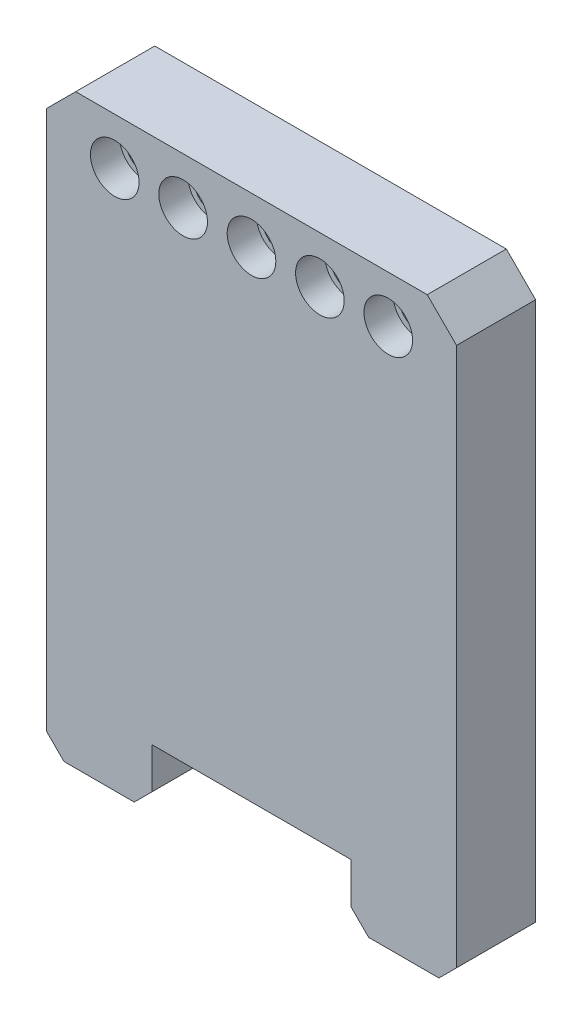
ISO-10303-21;
HEADER;
FILE_DESCRIPTION(('STEP AP214'),'2;1');
FILE_NAME('part.step','',(''),(''),'','','');
FILE_SCHEMA(('AUTOMOTIVE_DESIGN { 1 0 10303 214 1 1 1 1 }'));
ENDSEC;
DATA;
#1=APPLICATION_CONTEXT('core data for automotive mechanical design processes');
#2=APPLICATION_PROTOCOL_DEFINITION('international standard','automotive_design',2000,#1);
#3=PRODUCT_CONTEXT('',#1,'mechanical');
#4=PRODUCT('Part','Part','',(#3));
#5=PRODUCT_RELATED_PRODUCT_CATEGORY('part','',(#4));
#6=PRODUCT_DEFINITION_FORMATION('','',#4);
#7=PRODUCT_DEFINITION_CONTEXT('part definition',#1,'design');
#8=PRODUCT_DEFINITION('design','',#6,#7);
#9=PRODUCT_DEFINITION_SHAPE('','',#8);
#10=(LENGTH_UNIT() NAMED_UNIT(*) SI_UNIT(.MILLI.,.METRE.));
#11=(NAMED_UNIT(*) PLANE_ANGLE_UNIT() SI_UNIT($,.RADIAN.));
#12=(NAMED_UNIT(*) SI_UNIT($,.STERADIAN.) SOLID_ANGLE_UNIT());
#13=UNCERTAINTY_MEASURE_WITH_UNIT(LENGTH_MEASURE(1.E-05),#10,'distance_accuracy_value','');
#14=(GEOMETRIC_REPRESENTATION_CONTEXT(3) GLOBAL_UNCERTAINTY_ASSIGNED_CONTEXT((#13)) GLOBAL_UNIT_ASSIGNED_CONTEXT((#10,
#11,#12)) REPRESENTATION_CONTEXT('',''));
#15=CARTESIAN_POINT('',(0.,0.,0.));
#16=DIRECTION('',(0.,0.,1.));
#17=DIRECTION('',(1.,0.,0.));
#18=AXIS2_PLACEMENT_3D('',#15,#16,#17);
#19=CARTESIAN_POINT('',(0.,-50.,0.));
#20=DIRECTION('',(0.,1.,0.));
#21=DIRECTION('',(0.,0.,1.));
#22=AXIS2_PLACEMENT_3D('',#19,#20,#21);
#23=PLANE('',#22);
#24=DIRECTION('',(-1.,0.,0.));
#25=VECTOR('',#24,1.);
#26=CARTESIAN_POINT('',(-35.,-50.,-6.75));
#27=LINE('',#26,#25);
#28=CARTESIAN_POINT('',(-20.,-50.,-6.75));
#29=VERTEX_POINT('',#28);
#30=CARTESIAN_POINT('',(-32.,-50.,-6.75));
#31=VERTEX_POINT('',#30);
#32=EDGE_CURVE('E187',#29,#31,#27,.T.);
#33=ORIENTED_EDGE('',*,*,#32,.F.);
#34=DIRECTION('',(0.,0.,1.));
#35=VECTOR('',#34,1.);
#36=CARTESIAN_POINT('',(-20.,-50.,0.));
#37=LINE('',#36,#35);
#38=CARTESIAN_POINT('',(-20.,-50.,6.75));
#39=VERTEX_POINT('',#38);
#40=EDGE_CURVE('E279',#29,#39,#37,.T.);
#41=ORIENTED_EDGE('',*,*,#40,.T.);
#42=DIRECTION('',(1.,0.,0.));
#43=VECTOR('',#42,1.);
#44=CARTESIAN_POINT('',(-35.,-50.,6.75));
#45=LINE('',#44,#43);
#46=CARTESIAN_POINT('',(-32.,-50.,6.75));
#47=VERTEX_POINT('',#46);
#48=EDGE_CURVE('E193',#47,#39,#45,.T.);
#49=ORIENTED_EDGE('',*,*,#48,.F.);
#50=DIRECTION('',(0.,0.,-1.));
#51=VECTOR('',#50,1.);
#52=CARTESIAN_POINT('',(-32.,-50.,0.));
#53=LINE('',#52,#51);
#54=EDGE_CURVE('E276',#47,#31,#53,.T.);
#55=ORIENTED_EDGE('',*,*,#54,.T.);
#56=EDGE_LOOP('',(#33,#41,#49,#55));
#57=FACE_BOUND('',#56,.T.);
#58=ADVANCED_FACE('F43',(#57),#23,.F.);
#59=CARTESIAN_POINT('',(35.,50.,-6.75));
#60=DIRECTION('',(-1.,0.,0.));
#61=DIRECTION('',(0.,0.,1.));
#62=AXIS2_PLACEMENT_3D('',#59,#60,#61);
#63=PLANE('',#62);
#64=DIRECTION('',(0.,-1.,0.));
#65=VECTOR('',#64,1.);
#66=CARTESIAN_POINT('',(35.,50.,-6.75));
#67=LINE('',#66,#65);
#68=CARTESIAN_POINT('',(35.,45.,-6.75));
#69=VERTEX_POINT('',#68);
#70=CARTESIAN_POINT('',(35.,-47.,-6.75));
#71=VERTEX_POINT('',#70);
#72=EDGE_CURVE('E214',#69,#71,#67,.T.);
#73=ORIENTED_EDGE('',*,*,#72,.F.);
#74=DIRECTION('',(0.,0.,1.));
#75=VECTOR('',#74,1.);
#76=CARTESIAN_POINT('',(35.,45.,6.75));
#77=LINE('',#76,#75);
#78=CARTESIAN_POINT('',(35.,45.,6.75));
#79=VERTEX_POINT('',#78);
#80=EDGE_CURVE('E68',#69,#79,#77,.T.);
#81=ORIENTED_EDGE('',*,*,#80,.T.);
#82=DIRECTION('',(0.,-1.,0.));
#83=VECTOR('',#82,1.);
#84=CARTESIAN_POINT('',(35.,50.,6.75));
#85=LINE('',#84,#83);
#86=CARTESIAN_POINT('',(35.,-47.,6.75));
#87=VERTEX_POINT('',#86);
#88=EDGE_CURVE('E197',#79,#87,#85,.T.);
#89=ORIENTED_EDGE('',*,*,#88,.T.);
#90=DIRECTION('',(0.,0.,-1.));
#91=VECTOR('',#90,1.);
#92=CARTESIAN_POINT('',(35.,-47.,-6.75));
#93=LINE('',#92,#91);
#94=EDGE_CURVE('E286',#87,#71,#93,.T.);
#95=ORIENTED_EDGE('',*,*,#94,.T.);
#96=EDGE_LOOP('',(#73,#81,#89,#95));
#97=FACE_BOUND('',#96,.T.);
#98=ADVANCED_FACE('F323',(#97),#63,.F.);
#99=CARTESIAN_POINT('',(-35.,50.,-6.75));
#100=DIRECTION('',(0.,0.,1.));
#101=DIRECTION('',(1.,0.,0.));
#102=AXIS2_PLACEMENT_3D('',#99,#100,#101);
#103=PLANE('',#102);
#104=DIRECTION('',(-1.,0.,0.));
#105=VECTOR('',#104,1.);
#106=CARTESIAN_POINT('',(-35.,50.,-6.75));
#107=LINE('',#106,#105);
#108=CARTESIAN_POINT('',(30.,50.,-6.75));
#109=VERTEX_POINT('',#108);
#110=CARTESIAN_POINT('',(-30.,50.,-6.75));
#111=VERTEX_POINT('',#110);
#112=EDGE_CURVE('E188',#109,#111,#107,.T.);
#113=ORIENTED_EDGE('',*,*,#112,.F.);
#114=DIRECTION('',(0.707106781186546,-0.707106781186549,0.));
#115=VECTOR('',#114,1.);
#116=CARTESIAN_POINT('',(30.,50.,-6.75));
#117=LINE('',#116,#115);
#118=EDGE_CURVE('E305',#109,#69,#117,.T.);
#119=ORIENTED_EDGE('',*,*,#118,.T.);
#120=ORIENTED_EDGE('',*,*,#72,.T.);
#121=DIRECTION('',(0.70710678118655,0.707106781186545,0.));
#122=VECTOR('',#121,1.);
#123=CARTESIAN_POINT('',(35.,-47.,-6.75));
#124=LINE('',#123,#122);
#125=CARTESIAN_POINT('',(32.,-50.,-6.75));
#126=VERTEX_POINT('',#125);
#127=EDGE_CURVE('E252',#71,#126,#124,.F.);
#128=ORIENTED_EDGE('',*,*,#127,.T.);
#129=CARTESIAN_POINT('',(20.,-50.,-6.75));
#130=VERTEX_POINT('',#129);
#131=EDGE_CURVE('E201',#126,#130,#27,.T.);
#132=ORIENTED_EDGE('',*,*,#131,.T.);
#133=DIRECTION('',(0.707106781186548,-0.707106781186548,0.));
#134=VECTOR('',#133,1.);
#135=CARTESIAN_POINT('',(20.,-50.,-6.75));
#136=LINE('',#135,#134);
#137=CARTESIAN_POINT('',(17.,-47.,-6.75));
#138=VERTEX_POINT('',#137);
#139=EDGE_CURVE('E258',#130,#138,#136,.F.);
#140=ORIENTED_EDGE('',*,*,#139,.T.);
#141=DIRECTION('',(0.,1.,0.));
#142=VECTOR('',#141,1.);
#143=CARTESIAN_POINT('',(17.,50.,-6.75));
#144=LINE('',#143,#142);
#145=CARTESIAN_POINT('',(17.,-40.,-6.75000000000001));
#146=VERTEX_POINT('',#145);
#147=EDGE_CURVE('E177',#138,#146,#144,.T.);
#148=ORIENTED_EDGE('',*,*,#147,.T.);
#149=DIRECTION('',(-1.,0.,0.));
#150=VECTOR('',#149,1.);
#151=CARTESIAN_POINT('',(-35.,-40.,-6.75));
#152=LINE('',#151,#150);
#153=CARTESIAN_POINT('',(-17.,-40.,-6.75000000000001));
#154=VERTEX_POINT('',#153);
#155=EDGE_CURVE('E166',#146,#154,#152,.T.);
#156=ORIENTED_EDGE('',*,*,#155,.T.);
#157=DIRECTION('',(0.,-1.,0.));
#158=VECTOR('',#157,1.);
#159=CARTESIAN_POINT('',(-16.9999999999999,50.,-6.75));
#160=LINE('',#159,#158);
#161=CARTESIAN_POINT('',(-17.,-47.,-6.75));
#162=VERTEX_POINT('',#161);
#163=EDGE_CURVE('E181',#154,#162,#160,.T.);
#164=ORIENTED_EDGE('',*,*,#163,.T.);
#165=DIRECTION('',(0.707106781186548,0.707106781186548,0.));
#166=VECTOR('',#165,1.);
#167=CARTESIAN_POINT('',(-20.,-50.,-6.75));
#168=LINE('',#167,#166);
#169=EDGE_CURVE('E255',#162,#29,#168,.F.);
#170=ORIENTED_EDGE('',*,*,#169,.T.);
#171=ORIENTED_EDGE('',*,*,#32,.T.);
#172=DIRECTION('',(0.707106781186549,-0.707106781186546,0.));
#173=VECTOR('',#172,1.);
#174=CARTESIAN_POINT('',(-35.,-47.,-6.75));
#175=LINE('',#174,#173);
#176=CARTESIAN_POINT('',(-35.,-47.,-6.75));
#177=VERTEX_POINT('',#176);
#178=EDGE_CURVE('E248',#31,#177,#175,.F.);
#179=ORIENTED_EDGE('',*,*,#178,.T.);
#180=DIRECTION('',(0.,-1.,0.));
#181=VECTOR('',#180,1.);
#182=CARTESIAN_POINT('',(-35.,50.,-6.75));
#183=LINE('',#182,#181);
#184=CARTESIAN_POINT('',(-35.,45.,-6.75));
#185=VERTEX_POINT('',#184);
#186=EDGE_CURVE('E211',#185,#177,#183,.T.);
#187=ORIENTED_EDGE('',*,*,#186,.F.);
#188=DIRECTION('',(0.707106781186546,0.707106781186549,0.));
#189=VECTOR('',#188,1.);
#190=CARTESIAN_POINT('',(-30.,50.,-6.75));
#191=LINE('',#190,#189);
#192=EDGE_CURVE('E302',#185,#111,#191,.T.);
#193=ORIENTED_EDGE('',*,*,#192,.T.);
#194=EDGE_LOOP('',(#113,#119,#120,#128,#132,#140,#148,#156,#164,#170,#171,#179,#187,#193));
#195=FACE_BOUND('',#194,.T.);
#196=ADVANCED_FACE('F321',(#195),#103,.F.);
#197=CARTESIAN_POINT('',(-35.,50.,-6.75));
#198=DIRECTION('',(1.,0.,0.));
#199=DIRECTION('',(0.,0.,-1.));
#200=AXIS2_PLACEMENT_3D('',#197,#198,#199);
#201=PLANE('',#200);
#202=DIRECTION('',(0.,-1.,0.));
#203=VECTOR('',#202,1.);
#204=CARTESIAN_POINT('',(-35.,50.,6.75));
#205=LINE('',#204,#203);
#206=CARTESIAN_POINT('',(-35.,45.,6.75));
#207=VERTEX_POINT('',#206);
#208=CARTESIAN_POINT('',(-35.,-47.,6.75));
#209=VERTEX_POINT('',#208);
#210=EDGE_CURVE('E208',#207,#209,#205,.T.);
#211=ORIENTED_EDGE('',*,*,#210,.F.);
#212=DIRECTION('',(0.,0.,-1.));
#213=VECTOR('',#212,1.);
#214=CARTESIAN_POINT('',(-35.,45.,-6.75));
#215=LINE('',#214,#213);
#216=EDGE_CURVE('E11',#207,#185,#215,.T.);
#217=ORIENTED_EDGE('',*,*,#216,.T.);
#218=ORIENTED_EDGE('',*,*,#186,.T.);
#219=DIRECTION('',(0.,0.,1.));
#220=VECTOR('',#219,1.);
#221=CARTESIAN_POINT('',(-35.,-47.,-6.75));
#222=LINE('',#221,#220);
#223=EDGE_CURVE('E290',#177,#209,#222,.T.);
#224=ORIENTED_EDGE('',*,*,#223,.T.);
#225=EDGE_LOOP('',(#211,#217,#218,#224));
#226=FACE_BOUND('',#225,.T.);
#227=ADVANCED_FACE('F356',(#226),#201,.F.);
#228=CARTESIAN_POINT('',(-35.,50.,6.75));
#229=DIRECTION('',(0.,0.,-1.));
#230=DIRECTION('',(-1.,0.,0.));
#231=AXIS2_PLACEMENT_3D('',#228,#229,#230);
#232=PLANE('',#231);
#233=CARTESIAN_POINT('',(-23.33,42.,6.75));
#234=DIRECTION('',(0.,0.,1.));
#235=DIRECTION('',(1.,0.,0.));
#236=AXIS2_PLACEMENT_3D('',#233,#234,#235);
#237=CIRCLE('',#236,4.15);
#238=CARTESIAN_POINT('',(-19.18,42.,6.75));
#239=VERTEX_POINT('',#238);
#240=EDGE_CURVE('E549',#239,#239,#237,.T.);
#241=ORIENTED_EDGE('',*,*,#240,.F.);
#242=EDGE_LOOP('',(#241));
#243=FACE_BOUND('',#242,.T.);
#244=CARTESIAN_POINT('',(-11.66,42.,6.75));
#245=DIRECTION('',(0.,0.,1.));
#246=DIRECTION('',(1.,0.,0.));
#247=AXIS2_PLACEMENT_3D('',#244,#245,#246);
#248=CIRCLE('',#247,4.15);
#249=CARTESIAN_POINT('',(-7.51000000000002,42.,6.75));
#250=VERTEX_POINT('',#249);
#251=EDGE_CURVE('E557',#250,#250,#248,.T.);
#252=ORIENTED_EDGE('',*,*,#251,.F.);
#253=EDGE_LOOP('',(#252));
#254=FACE_BOUND('',#253,.T.);
#255=CARTESIAN_POINT('',(0.00999999999997531,42.,6.75));
#256=DIRECTION('',(0.,0.,1.));
#257=DIRECTION('',(1.,0.,0.));
#258=AXIS2_PLACEMENT_3D('',#255,#256,#257);
#259=CIRCLE('',#258,4.15);
#260=CARTESIAN_POINT('',(4.15999999999998,42.,6.75));
#261=VERTEX_POINT('',#260);
#262=EDGE_CURVE('E565',#261,#261,#259,.T.);
#263=ORIENTED_EDGE('',*,*,#262,.F.);
#264=EDGE_LOOP('',(#263));
#265=FACE_BOUND('',#264,.T.);
#266=CARTESIAN_POINT('',(11.68,42.,6.75));
#267=DIRECTION('',(0.,0.,1.));
#268=DIRECTION('',(1.,0.,0.));
#269=AXIS2_PLACEMENT_3D('',#266,#267,#268);
#270=CIRCLE('',#269,4.15);
#271=CARTESIAN_POINT('',(15.83,42.,6.75));
#272=VERTEX_POINT('',#271);
#273=EDGE_CURVE('E573',#272,#272,#270,.T.);
#274=ORIENTED_EDGE('',*,*,#273,.F.);
#275=EDGE_LOOP('',(#274));
#276=FACE_BOUND('',#275,.T.);
#277=CARTESIAN_POINT('',(23.35,42.,6.75));
#278=DIRECTION('',(0.,0.,1.));
#279=DIRECTION('',(1.,0.,0.));
#280=AXIS2_PLACEMENT_3D('',#277,#278,#279);
#281=CIRCLE('',#280,4.15);
#282=CARTESIAN_POINT('',(27.5,42.,6.75));
#283=VERTEX_POINT('',#282);
#284=EDGE_CURVE('E501',#283,#283,#281,.T.);
#285=ORIENTED_EDGE('',*,*,#284,.F.);
#286=EDGE_LOOP('',(#285));
#287=FACE_BOUND('',#286,.T.);
#288=ORIENTED_EDGE('',*,*,#88,.F.);
#289=DIRECTION('',(-0.707106781186546,0.707106781186549,0.));
#290=VECTOR('',#289,1.);
#291=CARTESIAN_POINT('',(30.,50.,6.75));
#292=LINE('',#291,#290);
#293=CARTESIAN_POINT('',(30.,50.,6.75));
#294=VERTEX_POINT('',#293);
#295=EDGE_CURVE('E53',#79,#294,#292,.T.);
#296=ORIENTED_EDGE('',*,*,#295,.T.);
#297=DIRECTION('',(1.,0.,0.));
#298=VECTOR('',#297,1.);
#299=CARTESIAN_POINT('',(-35.,50.,6.75));
#300=LINE('',#299,#298);
#301=CARTESIAN_POINT('',(-30.,50.,6.75));
#302=VERTEX_POINT('',#301);
#303=EDGE_CURVE('E192',#302,#294,#300,.T.);
#304=ORIENTED_EDGE('',*,*,#303,.F.);
#305=DIRECTION('',(-0.707106781186546,-0.707106781186549,0.));
#306=VECTOR('',#305,1.);
#307=CARTESIAN_POINT('',(-30.,50.,6.75));
#308=LINE('',#307,#306);
#309=EDGE_CURVE('E60',#302,#207,#308,.T.);
#310=ORIENTED_EDGE('',*,*,#309,.T.);
#311=ORIENTED_EDGE('',*,*,#210,.T.);
#312=DIRECTION('',(-0.707106781186549,0.707106781186546,0.));
#313=VECTOR('',#312,1.);
#314=CARTESIAN_POINT('',(-35.,-47.,6.75));
#315=LINE('',#314,#313);
#316=EDGE_CURVE('E263',#209,#47,#315,.F.);
#317=ORIENTED_EDGE('',*,*,#316,.T.);
#318=ORIENTED_EDGE('',*,*,#48,.T.);
#319=DIRECTION('',(-0.707106781186548,-0.707106781186548,0.));
#320=VECTOR('',#319,1.);
#321=CARTESIAN_POINT('',(-20.,-50.,6.75));
#322=LINE('',#321,#320);
#323=CARTESIAN_POINT('',(-17.,-47.,6.75));
#324=VERTEX_POINT('',#323);
#325=EDGE_CURVE('E270',#39,#324,#322,.F.);
#326=ORIENTED_EDGE('',*,*,#325,.T.);
#327=DIRECTION('',(0.,-1.,0.));
#328=VECTOR('',#327,1.);
#329=CARTESIAN_POINT('',(-17.,-50.,6.75));
#330=LINE('',#329,#328);
#331=CARTESIAN_POINT('',(-17.,-40.,6.75));
#332=VERTEX_POINT('',#331);
#333=EDGE_CURVE('E157',#332,#324,#330,.T.);
#334=ORIENTED_EDGE('',*,*,#333,.F.);
#335=DIRECTION('',(-1.,0.,0.));
#336=VECTOR('',#335,1.);
#337=CARTESIAN_POINT('',(-17.,-40.,6.75));
#338=LINE('',#337,#336);
#339=CARTESIAN_POINT('',(17.,-40.,6.75));
#340=VERTEX_POINT('',#339);
#341=EDGE_CURVE('E156',#340,#332,#338,.T.);
#342=ORIENTED_EDGE('',*,*,#341,.F.);
#343=DIRECTION('',(0.,1.,0.));
#344=VECTOR('',#343,1.);
#345=CARTESIAN_POINT('',(17.,-50.,6.75));
#346=LINE('',#345,#344);
#347=CARTESIAN_POINT('',(17.,-47.,6.75));
#348=VERTEX_POINT('',#347);
#349=EDGE_CURVE('E146',#348,#340,#346,.T.);
#350=ORIENTED_EDGE('',*,*,#349,.F.);
#351=DIRECTION('',(-0.707106781186548,0.707106781186548,0.));
#352=VECTOR('',#351,1.);
#353=CARTESIAN_POINT('',(20.,-50.,6.75));
#354=LINE('',#353,#352);
#355=CARTESIAN_POINT('',(20.,-50.,6.75));
#356=VERTEX_POINT('',#355);
#357=EDGE_CURVE('E273',#348,#356,#354,.F.);
#358=ORIENTED_EDGE('',*,*,#357,.T.);
#359=CARTESIAN_POINT('',(32.,-50.,6.75));
#360=VERTEX_POINT('',#359);
#361=EDGE_CURVE('E205',#356,#360,#45,.T.);
#362=ORIENTED_EDGE('',*,*,#361,.T.);
#363=DIRECTION('',(-0.70710678118655,-0.707106781186545,0.));
#364=VECTOR('',#363,1.);
#365=CARTESIAN_POINT('',(35.,-47.,6.75));
#366=LINE('',#365,#364);
#367=EDGE_CURVE('E266',#360,#87,#366,.F.);
#368=ORIENTED_EDGE('',*,*,#367,.T.);
#369=EDGE_LOOP('',(#288,#296,#304,#310,#311,#317,#318,#326,#334,#342,#350,#358,#362,#368));
#370=FACE_BOUND('',#369,.T.);
#371=ADVANCED_FACE('F170',(#243,#254,#265,#276,#287,#370),#232,.F.);
#372=CARTESIAN_POINT('',(0.,50.,0.));
#373=DIRECTION('',(0.,1.,0.));
#374=DIRECTION('',(0.,0.,1.));
#375=AXIS2_PLACEMENT_3D('',#372,#373,#374);
#376=PLANE('',#375);
#377=ORIENTED_EDGE('',*,*,#303,.T.);
#378=DIRECTION('',(0.,0.,-1.));
#379=VECTOR('',#378,1.);
#380=CARTESIAN_POINT('',(30.,50.,-6.75));
#381=LINE('',#380,#379);
#382=EDGE_CURVE('E298',#294,#109,#381,.T.);
#383=ORIENTED_EDGE('',*,*,#382,.T.);
#384=ORIENTED_EDGE('',*,*,#112,.T.);
#385=DIRECTION('',(0.,0.,1.));
#386=VECTOR('',#385,1.);
#387=CARTESIAN_POINT('',(-30.,50.,6.75));
#388=LINE('',#387,#386);
#389=EDGE_CURVE('E294',#111,#302,#388,.T.);
#390=ORIENTED_EDGE('',*,*,#389,.T.);
#391=EDGE_LOOP('',(#377,#383,#384,#390));
#392=FACE_BOUND('',#391,.T.);
#393=ADVANCED_FACE('F316',(#392),#376,.T.);
#394=ORIENTED_EDGE('',*,*,#361,.F.);
#395=DIRECTION('',(0.,0.,-1.));
#396=VECTOR('',#395,1.);
#397=CARTESIAN_POINT('',(20.,-50.,0.));
#398=LINE('',#397,#396);
#399=EDGE_CURVE('E244',#356,#130,#398,.T.);
#400=ORIENTED_EDGE('',*,*,#399,.T.);
#401=ORIENTED_EDGE('',*,*,#131,.F.);
#402=DIRECTION('',(0.,0.,1.));
#403=VECTOR('',#402,1.);
#404=CARTESIAN_POINT('',(32.,-50.,0.));
#405=LINE('',#404,#403);
#406=EDGE_CURVE('E241',#126,#360,#405,.T.);
#407=ORIENTED_EDGE('',*,*,#406,.T.);
#408=EDGE_LOOP('',(#394,#400,#401,#407));
#409=FACE_BOUND('',#408,.T.);
#410=ADVANCED_FACE('F333',(#409),#23,.F.);
#411=CARTESIAN_POINT('',(-17.,-40.,-93.25));
#412=DIRECTION('',(0.,1.,0.));
#413=DIRECTION('',(0.,0.,1.));
#414=AXIS2_PLACEMENT_3D('',#411,#412,#413);
#415=PLANE('',#414);
#416=CARTESIAN_POINT('',(10.,-40.,0.));
#417=DIRECTION('',(0.,1.,0.));
#418=DIRECTION('',(0.,0.,1.));
#419=AXIS2_PLACEMENT_3D('',#416,#417,#418);
#420=CIRCLE('',#419,3.72499999999999);
#421=CARTESIAN_POINT('',(10.,-40.,3.725));
#422=VERTEX_POINT('',#421);
#423=EDGE_CURVE('E229',#422,#422,#420,.T.);
#424=ORIENTED_EDGE('',*,*,#423,.T.);
#425=EDGE_LOOP('',(#424));
#426=FACE_BOUND('',#425,.T.);
#427=CARTESIAN_POINT('',(0.,-40.,0.));
#428=DIRECTION('',(0.,1.,0.));
#429=DIRECTION('',(0.,0.,1.));
#430=AXIS2_PLACEMENT_3D('',#427,#428,#429);
#431=CIRCLE('',#430,3.72499999999999);
#432=CARTESIAN_POINT('',(0.,-40.,3.72499999999999));
#433=VERTEX_POINT('',#432);
#434=EDGE_CURVE('E225',#433,#433,#431,.T.);
#435=ORIENTED_EDGE('',*,*,#434,.T.);
#436=EDGE_LOOP('',(#435));
#437=FACE_BOUND('',#436,.T.);
#438=CARTESIAN_POINT('',(-10.,-40.,0.));
#439=DIRECTION('',(0.,1.,0.));
#440=DIRECTION('',(0.,0.,1.));
#441=AXIS2_PLACEMENT_3D('',#438,#439,#440);
#442=CIRCLE('',#441,3.72499999999999);
#443=CARTESIAN_POINT('',(-10.,-40.,3.72499999999999));
#444=VERTEX_POINT('',#443);
#445=EDGE_CURVE('E221',#444,#444,#442,.T.);
#446=ORIENTED_EDGE('',*,*,#445,.T.);
#447=EDGE_LOOP('',(#446));
#448=FACE_BOUND('',#447,.T.);
#449=DIRECTION('',(0.,0.,1.));
#450=VECTOR('',#449,1.);
#451=CARTESIAN_POINT('',(17.,-40.,-93.25));
#452=LINE('',#451,#450);
#453=EDGE_CURVE('E150',#146,#340,#452,.T.);
#454=ORIENTED_EDGE('',*,*,#453,.T.);
#455=ORIENTED_EDGE('',*,*,#341,.T.);
#456=DIRECTION('',(0.,0.,1.));
#457=VECTOR('',#456,1.);
#458=CARTESIAN_POINT('',(-17.,-40.,-93.25));
#459=LINE('',#458,#457);
#460=EDGE_CURVE('E168',#154,#332,#459,.T.);
#461=ORIENTED_EDGE('',*,*,#460,.F.);
#462=ORIENTED_EDGE('',*,*,#155,.F.);
#463=EDGE_LOOP('',(#454,#455,#461,#462));
#464=FACE_BOUND('',#463,.T.);
#465=ADVANCED_FACE('F162',(#426,#437,#448,#464),#415,.F.);
#466=CARTESIAN_POINT('',(-17.,-50.,-93.25));
#467=DIRECTION('',(-1.,0.,0.));
#468=DIRECTION('',(0.,-1.,0.));
#469=AXIS2_PLACEMENT_3D('',#466,#467,#468);
#470=PLANE('',#469);
#471=ORIENTED_EDGE('',*,*,#333,.T.);
#472=DIRECTION('',(0.,0.,-1.));
#473=VECTOR('',#472,1.);
#474=CARTESIAN_POINT('',(-17.,-47.,-93.25));
#475=LINE('',#474,#473);
#476=EDGE_CURVE('E283',#324,#162,#475,.T.);
#477=ORIENTED_EDGE('',*,*,#476,.T.);
#478=ORIENTED_EDGE('',*,*,#163,.F.);
#479=ORIENTED_EDGE('',*,*,#460,.T.);
#480=EDGE_LOOP('',(#471,#477,#478,#479));
#481=FACE_BOUND('',#480,.T.);
#482=ADVANCED_FACE('F378',(#481),#470,.F.);
#483=CARTESIAN_POINT('',(17.,-50.,-93.25));
#484=DIRECTION('',(1.,0.,0.));
#485=DIRECTION('',(0.,0.,-1.));
#486=AXIS2_PLACEMENT_3D('',#483,#484,#485);
#487=PLANE('',#486);
#488=ORIENTED_EDGE('',*,*,#147,.F.);
#489=DIRECTION('',(0.,0.,1.));
#490=VECTOR('',#489,1.);
#491=CARTESIAN_POINT('',(17.,-47.,-93.25));
#492=LINE('',#491,#490);
#493=EDGE_CURVE('E152',#138,#348,#492,.T.);
#494=ORIENTED_EDGE('',*,*,#493,.T.);
#495=ORIENTED_EDGE('',*,*,#349,.T.);
#496=ORIENTED_EDGE('',*,*,#453,.F.);
#497=EDGE_LOOP('',(#488,#494,#495,#496));
#498=FACE_BOUND('',#497,.T.);
#499=ADVANCED_FACE('F149',(#498),#487,.F.);
#500=CARTESIAN_POINT('',(10.,-37.,0.));
#501=DIRECTION('',(0.,-1.,0.));
#502=DIRECTION('',(0.,0.,-1.));
#503=AXIS2_PLACEMENT_3D('',#500,#501,#502);
#504=CYLINDRICAL_SURFACE('',#503,3.225);
#505=CARTESIAN_POINT('',(10.,-39.5,0.));
#506=DIRECTION('',(0.,1.,0.));
#507=DIRECTION('',(0.,0.,1.));
#508=AXIS2_PLACEMENT_3D('',#505,#506,#507);
#509=CIRCLE('',#508,3.225);
#510=CARTESIAN_POINT('',(10.,-39.5,3.225));
#511=VERTEX_POINT('',#510);
#512=EDGE_CURVE('E217',#511,#511,#509,.F.);
#513=ORIENTED_EDGE('',*,*,#512,.T.);
#514=EDGE_LOOP('',(#513));
#515=FACE_BOUND('',#514,.T.);
#516=CARTESIAN_POINT('',(10.,-37.,0.));
#517=DIRECTION('',(0.,-1.,0.));
#518=DIRECTION('',(0.,0.,-1.));
#519=AXIS2_PLACEMENT_3D('',#516,#517,#518);
#520=CIRCLE('',#519,3.225);
#521=CARTESIAN_POINT('',(10.,-37.,-3.225));
#522=VERTEX_POINT('',#521);
#523=EDGE_CURVE('E548',#522,#522,#520,.T.);
#524=ORIENTED_EDGE('',*,*,#523,.F.);
#525=EDGE_LOOP('',(#524));
#526=FACE_BOUND('',#525,.T.);
#527=ADVANCED_FACE('F389',(#515,#526),#504,.F.);
#528=CARTESIAN_POINT('',(10.,-37.,0.));
#529=DIRECTION('',(0.,-1.,0.));
#530=DIRECTION('',(0.,0.,-1.));
#531=AXIS2_PLACEMENT_3D('',#528,#529,#530);
#532=PLANE('',#531);
#533=ORIENTED_EDGE('',*,*,#523,.T.);
#534=EDGE_LOOP('',(#533));
#535=FACE_BOUND('',#534,.T.);
#536=ADVANCED_FACE('F393',(#535),#532,.T.);
#537=CARTESIAN_POINT('',(0.,-37.,0.));
#538=DIRECTION('',(0.,-1.,0.));
#539=DIRECTION('',(0.,0.,-1.));
#540=AXIS2_PLACEMENT_3D('',#537,#538,#539);
#541=CYLINDRICAL_SURFACE('',#540,3.225);
#542=CARTESIAN_POINT('',(0.,-39.5,0.));
#543=DIRECTION('',(0.,1.,0.));
#544=DIRECTION('',(0.,0.,1.));
#545=AXIS2_PLACEMENT_3D('',#542,#543,#544);
#546=CIRCLE('',#545,3.225);
#547=CARTESIAN_POINT('',(0.,-39.5,3.225));
#548=VERTEX_POINT('',#547);
#549=EDGE_CURVE('E233',#548,#548,#546,.F.);
#550=ORIENTED_EDGE('',*,*,#549,.T.);
#551=EDGE_LOOP('',(#550));
#552=FACE_BOUND('',#551,.T.);
#553=CARTESIAN_POINT('',(0.,-37.,0.));
#554=DIRECTION('',(0.,-1.,0.));
#555=DIRECTION('',(0.,0.,-1.));
#556=AXIS2_PLACEMENT_3D('',#553,#554,#555);
#557=CIRCLE('',#556,3.225);
#558=CARTESIAN_POINT('',(0.,-37.,-3.225));
#559=VERTEX_POINT('',#558);
#560=EDGE_CURVE('E584',#559,#559,#557,.T.);
#561=ORIENTED_EDGE('',*,*,#560,.F.);
#562=EDGE_LOOP('',(#561));
#563=FACE_BOUND('',#562,.T.);
#564=ADVANCED_FACE('F397',(#552,#563),#541,.F.);
#565=CARTESIAN_POINT('',(0.,-37.,0.));
#566=DIRECTION('',(0.,-1.,0.));
#567=DIRECTION('',(0.,0.,-1.));
#568=AXIS2_PLACEMENT_3D('',#565,#566,#567);
#569=PLANE('',#568);
#570=ORIENTED_EDGE('',*,*,#560,.T.);
#571=EDGE_LOOP('',(#570));
#572=FACE_BOUND('',#571,.T.);
#573=ADVANCED_FACE('F401',(#572),#569,.T.);
#574=CARTESIAN_POINT('',(-10.,-37.,0.));
#575=DIRECTION('',(0.,-1.,0.));
#576=DIRECTION('',(0.,0.,-1.));
#577=AXIS2_PLACEMENT_3D('',#574,#575,#576);
#578=CYLINDRICAL_SURFACE('',#577,3.225);
#579=CARTESIAN_POINT('',(-10.,-39.5,0.));
#580=DIRECTION('',(0.,1.,0.));
#581=DIRECTION('',(0.,0.,1.));
#582=AXIS2_PLACEMENT_3D('',#579,#580,#581);
#583=CIRCLE('',#582,3.225);
#584=CARTESIAN_POINT('',(-10.,-39.5,3.225));
#585=VERTEX_POINT('',#584);
#586=EDGE_CURVE('E237',#585,#585,#583,.F.);
#587=ORIENTED_EDGE('',*,*,#586,.T.);
#588=EDGE_LOOP('',(#587));
#589=FACE_BOUND('',#588,.T.);
#590=CARTESIAN_POINT('',(-10.,-37.,0.));
#591=DIRECTION('',(0.,-1.,0.));
#592=DIRECTION('',(0.,0.,-1.));
#593=AXIS2_PLACEMENT_3D('',#590,#591,#592);
#594=CIRCLE('',#593,3.225);
#595=CARTESIAN_POINT('',(-10.,-37.,-3.225));
#596=VERTEX_POINT('',#595);
#597=EDGE_CURVE('E580',#596,#596,#594,.T.);
#598=ORIENTED_EDGE('',*,*,#597,.F.);
#599=EDGE_LOOP('',(#598));
#600=FACE_BOUND('',#599,.T.);
#601=ADVANCED_FACE('F405',(#589,#600),#578,.F.);
#602=CARTESIAN_POINT('',(-10.,-37.,0.));
#603=DIRECTION('',(0.,-1.,0.));
#604=DIRECTION('',(0.,0.,-1.));
#605=AXIS2_PLACEMENT_3D('',#602,#603,#604);
#606=PLANE('',#605);
#607=ORIENTED_EDGE('',*,*,#597,.T.);
#608=EDGE_LOOP('',(#607));
#609=FACE_BOUND('',#608,.T.);
#610=ADVANCED_FACE('F409',(#609),#606,.T.);
#611=CARTESIAN_POINT('',(10.,-39.5,0.));
#612=DIRECTION('',(0.,-1.,0.));
#613=DIRECTION('',(0.,0.,-1.));
#614=AXIS2_PLACEMENT_3D('',#611,#612,#613);
#615=CONICAL_SURFACE('',#614,3.225,0.78539816339746);
#616=ORIENTED_EDGE('',*,*,#423,.F.);
#617=EDGE_LOOP('',(#616));
#618=FACE_BOUND('',#617,.T.);
#619=ORIENTED_EDGE('',*,*,#512,.F.);
#620=EDGE_LOOP('',(#619));
#621=FACE_BOUND('',#620,.T.);
#622=ADVANCED_FACE('F413',(#618,#621),#615,.F.);
#623=CARTESIAN_POINT('',(0.,-39.5,0.));
#624=DIRECTION('',(0.,-1.,0.));
#625=DIRECTION('',(0.,0.,-1.));
#626=AXIS2_PLACEMENT_3D('',#623,#624,#625);
#627=CONICAL_SURFACE('',#626,3.225,0.78539816339746);
#628=ORIENTED_EDGE('',*,*,#434,.F.);
#629=EDGE_LOOP('',(#628));
#630=FACE_BOUND('',#629,.T.);
#631=ORIENTED_EDGE('',*,*,#549,.F.);
#632=EDGE_LOOP('',(#631));
#633=FACE_BOUND('',#632,.T.);
#634=ADVANCED_FACE('F746',(#630,#633),#627,.F.);
#635=CARTESIAN_POINT('',(-10.,-39.5,0.));
#636=DIRECTION('',(0.,-1.,0.));
#637=DIRECTION('',(0.,0.,-1.));
#638=AXIS2_PLACEMENT_3D('',#635,#636,#637);
#639=CONICAL_SURFACE('',#638,3.225,0.78539816339746);
#640=ORIENTED_EDGE('',*,*,#445,.F.);
#641=EDGE_LOOP('',(#640));
#642=FACE_BOUND('',#641,.T.);
#643=ORIENTED_EDGE('',*,*,#586,.F.);
#644=EDGE_LOOP('',(#643));
#645=FACE_BOUND('',#644,.T.);
#646=ADVANCED_FACE('F419',(#642,#645),#639,.F.);
#647=CARTESIAN_POINT('',(23.35,42.,1.75));
#648=DIRECTION('',(0.,0.,1.));
#649=DIRECTION('',(1.,0.,0.));
#650=AXIS2_PLACEMENT_3D('',#647,#648,#649);
#651=CYLINDRICAL_SURFACE('',#650,4.15);
#652=CARTESIAN_POINT('',(23.35,42.,1.75));
#653=DIRECTION('',(0.,0.,1.));
#654=DIRECTION('',(1.,0.,0.));
#655=AXIS2_PLACEMENT_3D('',#652,#653,#654);
#656=CIRCLE('',#655,4.15);
#657=CARTESIAN_POINT('',(27.5,42.,1.75));
#658=VERTEX_POINT('',#657);
#659=EDGE_CURVE('E507',#658,#658,#656,.T.);
#660=ORIENTED_EDGE('',*,*,#659,.F.);
#661=EDGE_LOOP('',(#660));
#662=FACE_BOUND('',#661,.T.);
#663=ORIENTED_EDGE('',*,*,#284,.T.);
#664=EDGE_LOOP('',(#663));
#665=FACE_BOUND('',#664,.T.);
#666=ADVANCED_FACE('F415',(#662,#665),#651,.F.);
#667=CARTESIAN_POINT('',(23.35,42.,1.75));
#668=DIRECTION('',(0.,0.,1.));
#669=DIRECTION('',(1.,0.,0.));
#670=AXIS2_PLACEMENT_3D('',#667,#668,#669);
#671=PLANE('',#670);
#672=CARTESIAN_POINT('',(23.35,42.,1.75));
#673=DIRECTION('',(0.,0.,1.));
#674=DIRECTION('',(1.,0.,0.));
#675=AXIS2_PLACEMENT_3D('',#672,#673,#674);
#676=CIRCLE('',#675,3.15);
#677=CARTESIAN_POINT('',(26.5,42.,1.75));
#678=VERTEX_POINT('',#677);
#679=EDGE_CURVE('E540',#678,#678,#676,.T.);
#680=ORIENTED_EDGE('',*,*,#679,.F.);
#681=EDGE_LOOP('',(#680));
#682=FACE_BOUND('',#681,.T.);
#683=ORIENTED_EDGE('',*,*,#659,.T.);
#684=EDGE_LOOP('',(#683));
#685=FACE_BOUND('',#684,.T.);
#686=ADVANCED_FACE('F418',(#682,#685),#671,.T.);
#687=CARTESIAN_POINT('',(11.68,42.,1.75));
#688=DIRECTION('',(0.,0.,1.));
#689=DIRECTION('',(1.,0.,0.));
#690=AXIS2_PLACEMENT_3D('',#687,#688,#689);
#691=CYLINDRICAL_SURFACE('',#690,4.15);
#692=CARTESIAN_POINT('',(11.68,42.,1.75));
#693=DIRECTION('',(0.,0.,1.));
#694=DIRECTION('',(1.,0.,0.));
#695=AXIS2_PLACEMENT_3D('',#692,#693,#694);
#696=CIRCLE('',#695,4.15);
#697=CARTESIAN_POINT('',(15.83,42.,1.75));
#698=VERTEX_POINT('',#697);
#699=EDGE_CURVE('E569',#698,#698,#696,.T.);
#700=ORIENTED_EDGE('',*,*,#699,.F.);
#701=EDGE_LOOP('',(#700));
#702=FACE_BOUND('',#701,.T.);
#703=ORIENTED_EDGE('',*,*,#273,.T.);
#704=EDGE_LOOP('',(#703));
#705=FACE_BOUND('',#704,.T.);
#706=ADVANCED_FACE('F423',(#702,#705),#691,.F.);
#707=CARTESIAN_POINT('',(11.68,42.,1.75));
#708=DIRECTION('',(0.,0.,1.));
#709=DIRECTION('',(1.,0.,0.));
#710=AXIS2_PLACEMENT_3D('',#707,#708,#709);
#711=PLANE('',#710);
#712=CARTESIAN_POINT('',(11.68,42.,1.75));
#713=DIRECTION('',(0.,0.,1.));
#714=DIRECTION('',(1.,0.,0.));
#715=AXIS2_PLACEMENT_3D('',#712,#713,#714);
#716=CIRCLE('',#715,3.15);
#717=CARTESIAN_POINT('',(14.83,42.,1.75));
#718=VERTEX_POINT('',#717);
#719=EDGE_CURVE('E532',#718,#718,#716,.T.);
#720=ORIENTED_EDGE('',*,*,#719,.F.);
#721=EDGE_LOOP('',(#720));
#722=FACE_BOUND('',#721,.T.);
#723=ORIENTED_EDGE('',*,*,#699,.T.);
#724=EDGE_LOOP('',(#723));
#725=FACE_BOUND('',#724,.T.);
#726=ADVANCED_FACE('F427',(#722,#725),#711,.T.);
#727=CARTESIAN_POINT('',(0.00999999999997531,42.,1.75));
#728=DIRECTION('',(0.,0.,1.));
#729=DIRECTION('',(1.,0.,0.));
#730=AXIS2_PLACEMENT_3D('',#727,#728,#729);
#731=CYLINDRICAL_SURFACE('',#730,4.15);
#732=CARTESIAN_POINT('',(0.00999999999997531,42.,1.75));
#733=DIRECTION('',(0.,0.,1.));
#734=DIRECTION('',(1.,0.,0.));
#735=AXIS2_PLACEMENT_3D('',#732,#733,#734);
#736=CIRCLE('',#735,4.15);
#737=CARTESIAN_POINT('',(4.15999999999998,42.,1.75));
#738=VERTEX_POINT('',#737);
#739=EDGE_CURVE('E561',#738,#738,#736,.T.);
#740=ORIENTED_EDGE('',*,*,#739,.F.);
#741=EDGE_LOOP('',(#740));
#742=FACE_BOUND('',#741,.T.);
#743=ORIENTED_EDGE('',*,*,#262,.T.);
#744=EDGE_LOOP('',(#743));
#745=FACE_BOUND('',#744,.T.);
#746=ADVANCED_FACE('F431',(#742,#745),#731,.F.);
#747=CARTESIAN_POINT('',(0.00999999999997531,42.,1.75));
#748=DIRECTION('',(0.,0.,1.));
#749=DIRECTION('',(1.,0.,0.));
#750=AXIS2_PLACEMENT_3D('',#747,#748,#749);
#751=PLANE('',#750);
#752=CARTESIAN_POINT('',(0.00999999999997531,42.,1.75));
#753=DIRECTION('',(0.,0.,1.));
#754=DIRECTION('',(1.,0.,0.));
#755=AXIS2_PLACEMENT_3D('',#752,#753,#754);
#756=CIRCLE('',#755,3.15);
#757=CARTESIAN_POINT('',(3.15999999999997,42.,1.75));
#758=VERTEX_POINT('',#757);
#759=EDGE_CURVE('E524',#758,#758,#756,.T.);
#760=ORIENTED_EDGE('',*,*,#759,.F.);
#761=EDGE_LOOP('',(#760));
#762=FACE_BOUND('',#761,.T.);
#763=ORIENTED_EDGE('',*,*,#739,.T.);
#764=EDGE_LOOP('',(#763));
#765=FACE_BOUND('',#764,.T.);
#766=ADVANCED_FACE('F435',(#762,#765),#751,.T.);
#767=CARTESIAN_POINT('',(-11.66,42.,1.75));
#768=DIRECTION('',(0.,0.,1.));
#769=DIRECTION('',(1.,0.,0.));
#770=AXIS2_PLACEMENT_3D('',#767,#768,#769);
#771=CYLINDRICAL_SURFACE('',#770,4.15);
#772=CARTESIAN_POINT('',(-11.66,42.,1.75));
#773=DIRECTION('',(0.,0.,1.));
#774=DIRECTION('',(1.,0.,0.));
#775=AXIS2_PLACEMENT_3D('',#772,#773,#774);
#776=CIRCLE('',#775,4.15);
#777=CARTESIAN_POINT('',(-7.51000000000002,42.,1.75));
#778=VERTEX_POINT('',#777);
#779=EDGE_CURVE('E553',#778,#778,#776,.T.);
#780=ORIENTED_EDGE('',*,*,#779,.F.);
#781=EDGE_LOOP('',(#780));
#782=FACE_BOUND('',#781,.T.);
#783=ORIENTED_EDGE('',*,*,#251,.T.);
#784=EDGE_LOOP('',(#783));
#785=FACE_BOUND('',#784,.T.);
#786=ADVANCED_FACE('F439',(#782,#785),#771,.F.);
#787=CARTESIAN_POINT('',(-11.66,42.,1.75));
#788=DIRECTION('',(0.,0.,1.));
#789=DIRECTION('',(1.,0.,0.));
#790=AXIS2_PLACEMENT_3D('',#787,#788,#789);
#791=PLANE('',#790);
#792=CARTESIAN_POINT('',(-11.66,42.,1.75));
#793=DIRECTION('',(0.,0.,1.));
#794=DIRECTION('',(1.,0.,0.));
#795=AXIS2_PLACEMENT_3D('',#792,#793,#794);
#796=CIRCLE('',#795,3.15);
#797=CARTESIAN_POINT('',(-8.51000000000002,42.,1.75));
#798=VERTEX_POINT('',#797);
#799=EDGE_CURVE('E516',#798,#798,#796,.T.);
#800=ORIENTED_EDGE('',*,*,#799,.F.);
#801=EDGE_LOOP('',(#800));
#802=FACE_BOUND('',#801,.T.);
#803=ORIENTED_EDGE('',*,*,#779,.T.);
#804=EDGE_LOOP('',(#803));
#805=FACE_BOUND('',#804,.T.);
#806=ADVANCED_FACE('F443',(#802,#805),#791,.T.);
#807=CARTESIAN_POINT('',(-23.33,42.,1.75));
#808=DIRECTION('',(0.,0.,1.));
#809=DIRECTION('',(1.,0.,0.));
#810=AXIS2_PLACEMENT_3D('',#807,#808,#809);
#811=CYLINDRICAL_SURFACE('',#810,4.15);
#812=CARTESIAN_POINT('',(-23.33,42.,1.75));
#813=DIRECTION('',(0.,0.,1.));
#814=DIRECTION('',(1.,0.,0.));
#815=AXIS2_PLACEMENT_3D('',#812,#813,#814);
#816=CIRCLE('',#815,4.15);
#817=CARTESIAN_POINT('',(-19.18,42.,1.75));
#818=VERTEX_POINT('',#817);
#819=EDGE_CURVE('E544',#818,#818,#816,.T.);
#820=ORIENTED_EDGE('',*,*,#819,.F.);
#821=EDGE_LOOP('',(#820));
#822=FACE_BOUND('',#821,.T.);
#823=ORIENTED_EDGE('',*,*,#240,.T.);
#824=EDGE_LOOP('',(#823));
#825=FACE_BOUND('',#824,.T.);
#826=ADVANCED_FACE('F447',(#822,#825),#811,.F.);
#827=CARTESIAN_POINT('',(-23.33,42.,1.75));
#828=DIRECTION('',(0.,0.,1.));
#829=DIRECTION('',(1.,0.,0.));
#830=AXIS2_PLACEMENT_3D('',#827,#828,#829);
#831=PLANE('',#830);
#832=CARTESIAN_POINT('',(-23.33,42.,1.75));
#833=DIRECTION('',(0.,0.,1.));
#834=DIRECTION('',(1.,0.,0.));
#835=AXIS2_PLACEMENT_3D('',#832,#833,#834);
#836=CIRCLE('',#835,3.15);
#837=CARTESIAN_POINT('',(-20.18,42.,1.75));
#838=VERTEX_POINT('',#837);
#839=EDGE_CURVE('E502',#838,#838,#836,.T.);
#840=ORIENTED_EDGE('',*,*,#839,.F.);
#841=EDGE_LOOP('',(#840));
#842=FACE_BOUND('',#841,.T.);
#843=ORIENTED_EDGE('',*,*,#819,.T.);
#844=EDGE_LOOP('',(#843));
#845=FACE_BOUND('',#844,.T.);
#846=ADVANCED_FACE('F451',(#842,#845),#831,.T.);
#847=CARTESIAN_POINT('',(-23.33,42.,-1.25));
#848=DIRECTION('',(0.,0.,1.));
#849=DIRECTION('',(1.,0.,0.));
#850=AXIS2_PLACEMENT_3D('',#847,#848,#849);
#851=CYLINDRICAL_SURFACE('',#850,3.15);
#852=CARTESIAN_POINT('',(-23.33,42.,-1.25));
#853=DIRECTION('',(0.,0.,1.));
#854=DIRECTION('',(1.,0.,0.));
#855=AXIS2_PLACEMENT_3D('',#852,#853,#854);
#856=CIRCLE('',#855,3.15);
#857=CARTESIAN_POINT('',(-20.18,42.,-1.25));
#858=VERTEX_POINT('',#857);
#859=EDGE_CURVE('E499',#858,#858,#856,.T.);
#860=ORIENTED_EDGE('',*,*,#859,.F.);
#861=EDGE_LOOP('',(#860));
#862=FACE_BOUND('',#861,.T.);
#863=ORIENTED_EDGE('',*,*,#839,.T.);
#864=EDGE_LOOP('',(#863));
#865=FACE_BOUND('',#864,.T.);
#866=ADVANCED_FACE('F455',(#862,#865),#851,.F.);
#867=CARTESIAN_POINT('',(-23.33,42.,-1.25));
#868=DIRECTION('',(0.,0.,1.));
#869=DIRECTION('',(1.,0.,0.));
#870=AXIS2_PLACEMENT_3D('',#867,#868,#869);
#871=PLANE('',#870);
#872=ORIENTED_EDGE('',*,*,#859,.T.);
#873=EDGE_LOOP('',(#872));
#874=FACE_BOUND('',#873,.T.);
#875=ADVANCED_FACE('F485',(#874),#871,.T.);
#876=CARTESIAN_POINT('',(-11.66,42.,-1.25));
#877=DIRECTION('',(0.,0.,1.));
#878=DIRECTION('',(1.,0.,0.));
#879=AXIS2_PLACEMENT_3D('',#876,#877,#878);
#880=CYLINDRICAL_SURFACE('',#879,3.15);
#881=CARTESIAN_POINT('',(-11.66,42.,-1.25));
#882=DIRECTION('',(0.,0.,1.));
#883=DIRECTION('',(1.,0.,0.));
#884=AXIS2_PLACEMENT_3D('',#881,#882,#883);
#885=CIRCLE('',#884,3.15);
#886=CARTESIAN_POINT('',(-8.51000000000002,42.,-1.25));
#887=VERTEX_POINT('',#886);
#888=EDGE_CURVE('E510',#887,#887,#885,.T.);
#889=ORIENTED_EDGE('',*,*,#888,.F.);
#890=EDGE_LOOP('',(#889));
#891=FACE_BOUND('',#890,.T.);
#892=ORIENTED_EDGE('',*,*,#799,.T.);
#893=EDGE_LOOP('',(#892));
#894=FACE_BOUND('',#893,.T.);
#895=ADVANCED_FACE('F482',(#891,#894),#880,.F.);
#896=CARTESIAN_POINT('',(-11.66,42.,-1.25));
#897=DIRECTION('',(0.,0.,1.));
#898=DIRECTION('',(1.,0.,0.));
#899=AXIS2_PLACEMENT_3D('',#896,#897,#898);
#900=PLANE('',#899);
#901=ORIENTED_EDGE('',*,*,#888,.T.);
#902=EDGE_LOOP('',(#901));
#903=FACE_BOUND('',#902,.T.);
#904=ADVANCED_FACE('F477',(#903),#900,.T.);
#905=CARTESIAN_POINT('',(0.00999999999997531,42.,-1.25));
#906=DIRECTION('',(0.,0.,1.));
#907=DIRECTION('',(1.,0.,0.));
#908=AXIS2_PLACEMENT_3D('',#905,#906,#907);
#909=CYLINDRICAL_SURFACE('',#908,3.15);
#910=CARTESIAN_POINT('',(0.00999999999997531,42.,-1.25));
#911=DIRECTION('',(0.,0.,1.));
#912=DIRECTION('',(1.,0.,0.));
#913=AXIS2_PLACEMENT_3D('',#910,#911,#912);
#914=CIRCLE('',#913,3.15);
#915=CARTESIAN_POINT('',(3.15999999999997,42.,-1.25));
#916=VERTEX_POINT('',#915);
#917=EDGE_CURVE('E520',#916,#916,#914,.T.);
#918=ORIENTED_EDGE('',*,*,#917,.F.);
#919=EDGE_LOOP('',(#918));
#920=FACE_BOUND('',#919,.T.);
#921=ORIENTED_EDGE('',*,*,#759,.T.);
#922=EDGE_LOOP('',(#921));
#923=FACE_BOUND('',#922,.T.);
#924=ADVANCED_FACE('F474',(#920,#923),#909,.F.);
#925=CARTESIAN_POINT('',(0.00999999999997531,42.,-1.25));
#926=DIRECTION('',(0.,0.,1.));
#927=DIRECTION('',(1.,0.,0.));
#928=AXIS2_PLACEMENT_3D('',#925,#926,#927);
#929=PLANE('',#928);
#930=ORIENTED_EDGE('',*,*,#917,.T.);
#931=EDGE_LOOP('',(#930));
#932=FACE_BOUND('',#931,.T.);
#933=ADVANCED_FACE('F469',(#932),#929,.T.);
#934=CARTESIAN_POINT('',(11.68,42.,-1.25));
#935=DIRECTION('',(0.,0.,1.));
#936=DIRECTION('',(1.,0.,0.));
#937=AXIS2_PLACEMENT_3D('',#934,#935,#936);
#938=CYLINDRICAL_SURFACE('',#937,3.15);
#939=CARTESIAN_POINT('',(11.68,42.,-1.25));
#940=DIRECTION('',(0.,0.,1.));
#941=DIRECTION('',(1.,0.,0.));
#942=AXIS2_PLACEMENT_3D('',#939,#940,#941);
#943=CIRCLE('',#942,3.15);
#944=CARTESIAN_POINT('',(14.83,42.,-1.25));
#945=VERTEX_POINT('',#944);
#946=EDGE_CURVE('E528',#945,#945,#943,.T.);
#947=ORIENTED_EDGE('',*,*,#946,.F.);
#948=EDGE_LOOP('',(#947));
#949=FACE_BOUND('',#948,.T.);
#950=ORIENTED_EDGE('',*,*,#719,.T.);
#951=EDGE_LOOP('',(#950));
#952=FACE_BOUND('',#951,.T.);
#953=ADVANCED_FACE('F466',(#949,#952),#938,.F.);
#954=CARTESIAN_POINT('',(11.68,42.,-1.25));
#955=DIRECTION('',(0.,0.,1.));
#956=DIRECTION('',(1.,0.,0.));
#957=AXIS2_PLACEMENT_3D('',#954,#955,#956);
#958=PLANE('',#957);
#959=ORIENTED_EDGE('',*,*,#946,.T.);
#960=EDGE_LOOP('',(#959));
#961=FACE_BOUND('',#960,.T.);
#962=ADVANCED_FACE('F461',(#961),#958,.T.);
#963=CARTESIAN_POINT('',(23.35,42.,-1.25));
#964=DIRECTION('',(0.,0.,1.));
#965=DIRECTION('',(1.,0.,0.));
#966=AXIS2_PLACEMENT_3D('',#963,#964,#965);
#967=CYLINDRICAL_SURFACE('',#966,3.15);
#968=CARTESIAN_POINT('',(23.35,42.,-1.25));
#969=DIRECTION('',(0.,0.,1.));
#970=DIRECTION('',(1.,0.,0.));
#971=AXIS2_PLACEMENT_3D('',#968,#969,#970);
#972=CIRCLE('',#971,3.15);
#973=CARTESIAN_POINT('',(26.5,42.,-1.25));
#974=VERTEX_POINT('',#973);
#975=EDGE_CURVE('E536',#974,#974,#972,.T.);
#976=ORIENTED_EDGE('',*,*,#975,.F.);
#977=EDGE_LOOP('',(#976));
#978=FACE_BOUND('',#977,.T.);
#979=ORIENTED_EDGE('',*,*,#679,.T.);
#980=EDGE_LOOP('',(#979));
#981=FACE_BOUND('',#980,.T.);
#982=ADVANCED_FACE('F457',(#978,#981),#967,.F.);
#983=CARTESIAN_POINT('',(23.35,42.,-1.25));
#984=DIRECTION('',(0.,0.,1.));
#985=DIRECTION('',(1.,0.,0.));
#986=AXIS2_PLACEMENT_3D('',#983,#984,#985);
#987=PLANE('',#986);
#988=ORIENTED_EDGE('',*,*,#975,.T.);
#989=EDGE_LOOP('',(#988));
#990=FACE_BOUND('',#989,.T.);
#991=ADVANCED_FACE('F460',(#990),#987,.T.);
#992=CARTESIAN_POINT('',(20.,-50.,0.));
#993=DIRECTION('',(0.707106781186547,0.707106781186547,0.));
#994=DIRECTION('',(0.,0.,-1.));
#995=AXIS2_PLACEMENT_3D('',#992,#993,#994);
#996=PLANE('',#995);
#997=ORIENTED_EDGE('',*,*,#357,.F.);
#998=ORIENTED_EDGE('',*,*,#493,.F.);
#999=ORIENTED_EDGE('',*,*,#139,.F.);
#1000=ORIENTED_EDGE('',*,*,#399,.F.);
#1001=EDGE_LOOP('',(#997,#998,#999,#1000));
#1002=FACE_BOUND('',#1001,.T.);
#1003=ADVANCED_FACE('F339',(#1002),#996,.F.);
#1004=CARTESIAN_POINT('',(-20.,-50.,0.));
#1005=DIRECTION('',(-0.707106781186548,0.707106781186548,0.));
#1006=DIRECTION('',(0.,0.,1.));
#1007=AXIS2_PLACEMENT_3D('',#1004,#1005,#1006);
#1008=PLANE('',#1007);
#1009=ORIENTED_EDGE('',*,*,#169,.F.);
#1010=ORIENTED_EDGE('',*,*,#476,.F.);
#1011=ORIENTED_EDGE('',*,*,#325,.F.);
#1012=ORIENTED_EDGE('',*,*,#40,.F.);
#1013=EDGE_LOOP('',(#1009,#1010,#1011,#1012));
#1014=FACE_BOUND('',#1013,.T.);
#1015=ADVANCED_FACE('F346',(#1014),#1008,.F.);
#1016=CARTESIAN_POINT('',(35.,-47.,-6.75));
#1017=DIRECTION('',(-0.707106781186545,0.70710678118655,0.));
#1018=DIRECTION('',(0.,0.,-1.));
#1019=AXIS2_PLACEMENT_3D('',#1016,#1017,#1018);
#1020=PLANE('',#1019);
#1021=ORIENTED_EDGE('',*,*,#367,.F.);
#1022=ORIENTED_EDGE('',*,*,#406,.F.);
#1023=ORIENTED_EDGE('',*,*,#127,.F.);
#1024=ORIENTED_EDGE('',*,*,#94,.F.);
#1025=EDGE_LOOP('',(#1021,#1022,#1023,#1024));
#1026=FACE_BOUND('',#1025,.T.);
#1027=ADVANCED_FACE('F327',(#1026),#1020,.F.);
#1028=CARTESIAN_POINT('',(-35.,-47.,-6.75));
#1029=DIRECTION('',(0.707106781186546,0.707106781186549,0.));
#1030=DIRECTION('',(0.,0.,1.));
#1031=AXIS2_PLACEMENT_3D('',#1028,#1029,#1030);
#1032=PLANE('',#1031);
#1033=ORIENTED_EDGE('',*,*,#178,.F.);
#1034=ORIENTED_EDGE('',*,*,#54,.F.);
#1035=ORIENTED_EDGE('',*,*,#316,.F.);
#1036=ORIENTED_EDGE('',*,*,#223,.F.);
#1037=EDGE_LOOP('',(#1033,#1034,#1035,#1036));
#1038=FACE_BOUND('',#1037,.T.);
#1039=ADVANCED_FACE('F354',(#1038),#1032,.F.);
#1040=CARTESIAN_POINT('',(30.,50.,0.));
#1041=DIRECTION('',(0.707106781186549,0.707106781186546,0.));
#1042=DIRECTION('',(0.,0.,1.));
#1043=AXIS2_PLACEMENT_3D('',#1040,#1041,#1042);
#1044=PLANE('',#1043);
#1045=ORIENTED_EDGE('',*,*,#295,.F.);
#1046=ORIENTED_EDGE('',*,*,#80,.F.);
#1047=ORIENTED_EDGE('',*,*,#118,.F.);
#1048=ORIENTED_EDGE('',*,*,#382,.F.);
#1049=EDGE_LOOP('',(#1045,#1046,#1047,#1048));
#1050=FACE_BOUND('',#1049,.T.);
#1051=ADVANCED_FACE('F319',(#1050),#1044,.T.);
#1052=CARTESIAN_POINT('',(-30.,50.,0.));
#1053=DIRECTION('',(-0.707106781186549,0.707106781186546,0.));
#1054=DIRECTION('',(0.,0.,-1.));
#1055=AXIS2_PLACEMENT_3D('',#1052,#1053,#1054);
#1056=PLANE('',#1055);
#1057=ORIENTED_EDGE('',*,*,#192,.F.);
#1058=ORIENTED_EDGE('',*,*,#216,.F.);
#1059=ORIENTED_EDGE('',*,*,#309,.F.);
#1060=ORIENTED_EDGE('',*,*,#389,.F.);
#1061=EDGE_LOOP('',(#1057,#1058,#1059,#1060));
#1062=FACE_BOUND('',#1061,.T.);
#1063=ADVANCED_FACE('F46',(#1062),#1056,.T.);
#1064=CLOSED_SHELL('',(#58,#98,#196,#227,#371,#393,#410,#465,#482,#499,#527,#536,#564,#573,#601,
#610,#622,#634,#646,#666,#686,#706,#726,#746,#766,#786,#806,#826,#846,#866,#875,#895,#904,#924,
#933,#953,#962,#982,#991,#1003,#1015,#1027,#1039,#1051,#1063));
#1065=MANIFOLD_SOLID_BREP('B2',#1064);
#1066=ADVANCED_BREP_SHAPE_REPRESENTATION('',(#18,#1065),#14);
#1067=SHAPE_DEFINITION_REPRESENTATION(#9,#1066);
ENDSEC;
END-ISO-10303-21;
